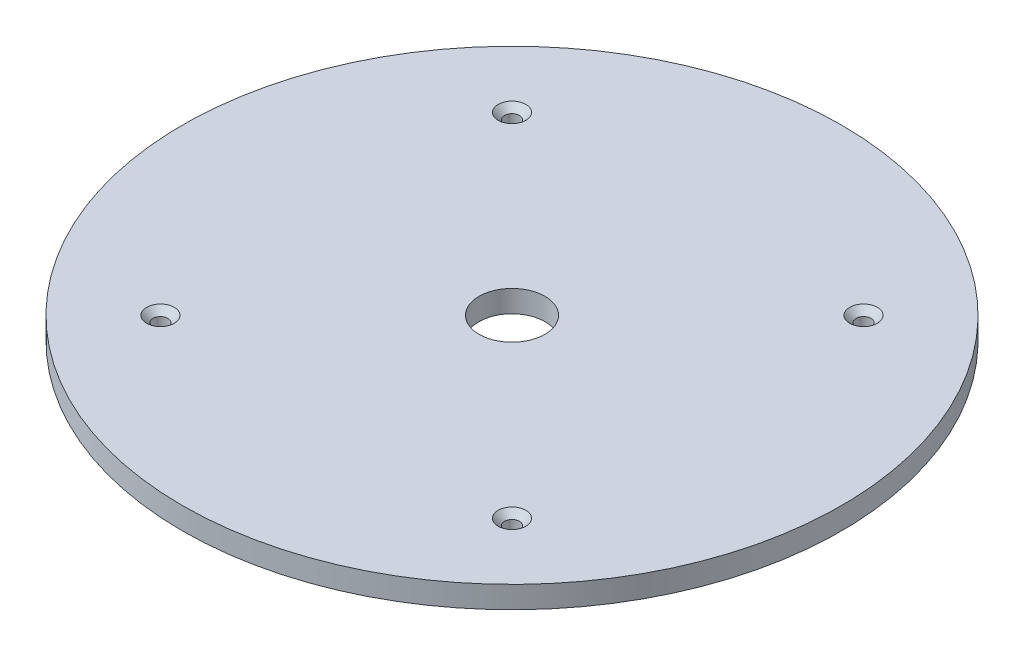
ISO-10303-21;
HEADER;
FILE_DESCRIPTION(('STEP AP214'),'2;1');
FILE_NAME('part.step','',(''),(''),'','','');
FILE_SCHEMA(('AUTOMOTIVE_DESIGN { 1 0 10303 214 1 1 1 1 }'));
ENDSEC;
DATA;
#1=APPLICATION_CONTEXT('core data for automotive mechanical design processes');
#2=APPLICATION_PROTOCOL_DEFINITION('international standard','automotive_design',2000,#1);
#3=PRODUCT_CONTEXT('',#1,'mechanical');
#4=PRODUCT('Part','Part','',(#3));
#5=PRODUCT_RELATED_PRODUCT_CATEGORY('part','',(#4));
#6=PRODUCT_DEFINITION_FORMATION('','',#4);
#7=PRODUCT_DEFINITION_CONTEXT('part definition',#1,'design');
#8=PRODUCT_DEFINITION('design','',#6,#7);
#9=PRODUCT_DEFINITION_SHAPE('','',#8);
#10=(LENGTH_UNIT() NAMED_UNIT(*) SI_UNIT(.MILLI.,.METRE.));
#11=(NAMED_UNIT(*) PLANE_ANGLE_UNIT() SI_UNIT($,.RADIAN.));
#12=(NAMED_UNIT(*) SI_UNIT($,.STERADIAN.) SOLID_ANGLE_UNIT());
#13=UNCERTAINTY_MEASURE_WITH_UNIT(LENGTH_MEASURE(1.E-05),#10,'distance_accuracy_value','');
#14=(GEOMETRIC_REPRESENTATION_CONTEXT(3) GLOBAL_UNCERTAINTY_ASSIGNED_CONTEXT((#13)) GLOBAL_UNIT_ASSIGNED_CONTEXT((#10,
#11,#12)) REPRESENTATION_CONTEXT('',''));
#15=CARTESIAN_POINT('',(0.,0.,0.));
#16=DIRECTION('',(0.,0.,1.));
#17=DIRECTION('',(1.,0.,0.));
#18=AXIS2_PLACEMENT_3D('',#15,#16,#17);
#19=CARTESIAN_POINT('',(0.,5.,0.));
#20=DIRECTION('',(0.,-1.,0.));
#21=DIRECTION('',(0.,0.,-1.));
#22=AXIS2_PLACEMENT_3D('',#19,#20,#21);
#23=CYLINDRICAL_SURFACE('',#22,75.);
#24=CARTESIAN_POINT('',(0.,5.,0.));
#25=DIRECTION('',(0.,1.,0.));
#26=DIRECTION('',(0.,0.,1.));
#27=AXIS2_PLACEMENT_3D('',#24,#25,#26);
#28=CIRCLE('',#27,75.);
#29=CARTESIAN_POINT('',(0.,5.,75.));
#30=VERTEX_POINT('',#29);
#31=EDGE_CURVE('E10',#30,#30,#28,.T.);
#32=ORIENTED_EDGE('',*,*,#31,.F.);
#33=EDGE_LOOP('',(#32));
#34=FACE_BOUND('',#33,.T.);
#35=CARTESIAN_POINT('',(0.,0.,0.));
#36=DIRECTION('',(0.,1.,0.));
#37=DIRECTION('',(0.,0.,1.));
#38=AXIS2_PLACEMENT_3D('',#35,#36,#37);
#39=CIRCLE('',#38,75.);
#40=CARTESIAN_POINT('',(0.,0.,75.));
#41=VERTEX_POINT('',#40);
#42=EDGE_CURVE('E39',#41,#41,#39,.T.);
#43=ORIENTED_EDGE('',*,*,#42,.T.);
#44=EDGE_LOOP('',(#43));
#45=FACE_BOUND('',#44,.T.);
#46=ADVANCED_FACE('F36',(#34,#45),#23,.T.);
#47=CARTESIAN_POINT('',(0.,5.,0.));
#48=DIRECTION('',(0.,1.,0.));
#49=DIRECTION('',(0.,0.,1.));
#50=AXIS2_PLACEMENT_3D('',#47,#48,#49);
#51=PLANE('',#50);
#52=CARTESIAN_POINT('',(0.,5.,0.));
#53=DIRECTION('',(0.,1.,0.));
#54=DIRECTION('',(0.,0.,1.));
#55=AXIS2_PLACEMENT_3D('',#52,#53,#54);
#56=CIRCLE('',#55,7.5);
#57=CARTESIAN_POINT('',(0.,5.,7.5));
#58=VERTEX_POINT('',#57);
#59=EDGE_CURVE('E98',#58,#58,#56,.T.);
#60=ORIENTED_EDGE('',*,*,#59,.F.);
#61=EDGE_LOOP('',(#60));
#62=FACE_BOUND('',#61,.T.);
#63=CARTESIAN_POINT('',(-40.0000000000008,5.,-40.));
#64=DIRECTION('',(0.,1.,0.));
#65=DIRECTION('',(0.,0.,1.));
#66=AXIS2_PLACEMENT_3D('',#63,#64,#65);
#67=CIRCLE('',#66,3.15);
#68=CARTESIAN_POINT('',(-40.0000000000008,5.,-36.85));
#69=VERTEX_POINT('',#68);
#70=EDGE_CURVE('E93',#69,#69,#67,.T.);
#71=ORIENTED_EDGE('',*,*,#70,.F.);
#72=EDGE_LOOP('',(#71));
#73=FACE_BOUND('',#72,.T.);
#74=CARTESIAN_POINT('',(39.9999999999992,5.,-40.));
#75=DIRECTION('',(0.,1.,0.));
#76=DIRECTION('',(0.,0.,1.));
#77=AXIS2_PLACEMENT_3D('',#74,#75,#76);
#78=CIRCLE('',#77,3.15);
#79=CARTESIAN_POINT('',(39.9999999999992,5.,-36.85));
#80=VERTEX_POINT('',#79);
#81=EDGE_CURVE('E81',#80,#80,#78,.T.);
#82=ORIENTED_EDGE('',*,*,#81,.F.);
#83=EDGE_LOOP('',(#82));
#84=FACE_BOUND('',#83,.T.);
#85=CARTESIAN_POINT('',(40.,5.,40.));
#86=DIRECTION('',(0.,1.,0.));
#87=DIRECTION('',(0.,0.,1.));
#88=AXIS2_PLACEMENT_3D('',#85,#86,#87);
#89=CIRCLE('',#88,3.15);
#90=CARTESIAN_POINT('',(40.,5.,43.15));
#91=VERTEX_POINT('',#90);
#92=EDGE_CURVE('E69',#91,#91,#89,.T.);
#93=ORIENTED_EDGE('',*,*,#92,.F.);
#94=EDGE_LOOP('',(#93));
#95=FACE_BOUND('',#94,.T.);
#96=CARTESIAN_POINT('',(-40.,5.,40.));
#97=DIRECTION('',(0.,1.,0.));
#98=DIRECTION('',(0.,0.,1.));
#99=AXIS2_PLACEMENT_3D('',#96,#97,#98);
#100=CIRCLE('',#99,3.15);
#101=CARTESIAN_POINT('',(-40.,5.,43.15));
#102=VERTEX_POINT('',#101);
#103=EDGE_CURVE('E57',#102,#102,#100,.T.);
#104=ORIENTED_EDGE('',*,*,#103,.F.);
#105=EDGE_LOOP('',(#104));
#106=FACE_BOUND('',#105,.T.);
#107=ORIENTED_EDGE('',*,*,#31,.T.);
#108=EDGE_LOOP('',(#107));
#109=FACE_BOUND('',#108,.T.);
#110=ADVANCED_FACE('F116',(#62,#73,#84,#95,#106,#109),#51,.T.);
#111=CARTESIAN_POINT('',(0.,0.,0.));
#112=DIRECTION('',(0.,1.,0.));
#113=DIRECTION('',(0.,0.,1.));
#114=AXIS2_PLACEMENT_3D('',#111,#112,#113);
#115=PLANE('',#114);
#116=CARTESIAN_POINT('',(0.,0.,0.));
#117=DIRECTION('',(0.,1.,0.));
#118=DIRECTION('',(0.,0.,1.));
#119=AXIS2_PLACEMENT_3D('',#116,#117,#118);
#120=CIRCLE('',#119,7.5);
#121=CARTESIAN_POINT('',(0.,0.,7.5));
#122=VERTEX_POINT('',#121);
#123=EDGE_CURVE('E97',#122,#122,#120,.T.);
#124=ORIENTED_EDGE('',*,*,#123,.T.);
#125=EDGE_LOOP('',(#124));
#126=FACE_BOUND('',#125,.T.);
#127=CARTESIAN_POINT('',(-40.0000000000008,0.,-40.));
#128=DIRECTION('',(0.,1.,0.));
#129=DIRECTION('',(0.,0.,1.));
#130=AXIS2_PLACEMENT_3D('',#127,#128,#129);
#131=CIRCLE('',#130,1.7);
#132=CARTESIAN_POINT('',(-40.0000000000008,0.,-38.3));
#133=VERTEX_POINT('',#132);
#134=EDGE_CURVE('E85',#133,#133,#131,.T.);
#135=ORIENTED_EDGE('',*,*,#134,.T.);
#136=EDGE_LOOP('',(#135));
#137=FACE_BOUND('',#136,.T.);
#138=CARTESIAN_POINT('',(39.9999999999992,0.,-40.));
#139=DIRECTION('',(0.,1.,0.));
#140=DIRECTION('',(0.,0.,1.));
#141=AXIS2_PLACEMENT_3D('',#138,#139,#140);
#142=CIRCLE('',#141,1.7);
#143=CARTESIAN_POINT('',(39.9999999999992,0.,-38.3));
#144=VERTEX_POINT('',#143);
#145=EDGE_CURVE('E73',#144,#144,#142,.T.);
#146=ORIENTED_EDGE('',*,*,#145,.T.);
#147=EDGE_LOOP('',(#146));
#148=FACE_BOUND('',#147,.T.);
#149=CARTESIAN_POINT('',(40.,0.,40.));
#150=DIRECTION('',(0.,1.,0.));
#151=DIRECTION('',(0.,0.,1.));
#152=AXIS2_PLACEMENT_3D('',#149,#150,#151);
#153=CIRCLE('',#152,1.7);
#154=CARTESIAN_POINT('',(40.,0.,41.7));
#155=VERTEX_POINT('',#154);
#156=EDGE_CURVE('E61',#155,#155,#153,.T.);
#157=ORIENTED_EDGE('',*,*,#156,.T.);
#158=EDGE_LOOP('',(#157));
#159=FACE_BOUND('',#158,.T.);
#160=CARTESIAN_POINT('',(-40.,0.,40.));
#161=DIRECTION('',(0.,1.,0.));
#162=DIRECTION('',(0.,0.,1.));
#163=AXIS2_PLACEMENT_3D('',#160,#161,#162);
#164=CIRCLE('',#163,1.7);
#165=CARTESIAN_POINT('',(-40.,0.,41.7));
#166=VERTEX_POINT('',#165);
#167=EDGE_CURVE('E48',#166,#166,#164,.T.);
#168=ORIENTED_EDGE('',*,*,#167,.T.);
#169=EDGE_LOOP('',(#168));
#170=FACE_BOUND('',#169,.T.);
#171=ORIENTED_EDGE('',*,*,#42,.F.);
#172=EDGE_LOOP('',(#171));
#173=FACE_BOUND('',#172,.T.);
#174=ADVANCED_FACE('F106',(#126,#137,#148,#159,#170,#173),#115,.F.);
#175=CARTESIAN_POINT('',(-40.,5.,40.));
#176=DIRECTION('',(0.,1.,0.));
#177=DIRECTION('',(0.,0.,1.));
#178=AXIS2_PLACEMENT_3D('',#175,#176,#177);
#179=CYLINDRICAL_SURFACE('',#178,1.7);
#180=ORIENTED_EDGE('',*,*,#167,.F.);
#181=EDGE_LOOP('',(#180));
#182=FACE_BOUND('',#181,.T.);
#183=CARTESIAN_POINT('',(-40.,3.55,40.));
#184=DIRECTION('',(0.,1.,0.));
#185=DIRECTION('',(0.,0.,1.));
#186=AXIS2_PLACEMENT_3D('',#183,#184,#185);
#187=CIRCLE('',#186,1.7);
#188=CARTESIAN_POINT('',(-40.,3.55,41.7));
#189=VERTEX_POINT('',#188);
#190=EDGE_CURVE('E53',#189,#189,#187,.T.);
#191=ORIENTED_EDGE('',*,*,#190,.T.);
#192=EDGE_LOOP('',(#191));
#193=FACE_BOUND('',#192,.T.);
#194=ADVANCED_FACE('F131',(#182,#193),#179,.F.);
#195=CARTESIAN_POINT('',(-40.,5.,40.));
#196=DIRECTION('',(0.,1.,0.));
#197=DIRECTION('',(0.,0.,1.));
#198=AXIS2_PLACEMENT_3D('',#195,#196,#197);
#199=CONICAL_SURFACE('',#198,3.15,0.785398163397448);
#200=ORIENTED_EDGE('',*,*,#190,.F.);
#201=EDGE_LOOP('',(#200));
#202=FACE_BOUND('',#201,.T.);
#203=ORIENTED_EDGE('',*,*,#103,.T.);
#204=EDGE_LOOP('',(#203));
#205=FACE_BOUND('',#204,.T.);
#206=ADVANCED_FACE('F128',(#202,#205),#199,.F.);
#207=CARTESIAN_POINT('',(40.,5.,40.));
#208=DIRECTION('',(0.,1.,0.));
#209=DIRECTION('',(0.,0.,1.));
#210=AXIS2_PLACEMENT_3D('',#207,#208,#209);
#211=CYLINDRICAL_SURFACE('',#210,1.7);
#212=ORIENTED_EDGE('',*,*,#156,.F.);
#213=EDGE_LOOP('',(#212));
#214=FACE_BOUND('',#213,.T.);
#215=CARTESIAN_POINT('',(40.,3.55,40.));
#216=DIRECTION('',(0.,1.,0.));
#217=DIRECTION('',(0.,0.,1.));
#218=AXIS2_PLACEMENT_3D('',#215,#216,#217);
#219=CIRCLE('',#218,1.7);
#220=CARTESIAN_POINT('',(40.,3.55,41.7));
#221=VERTEX_POINT('',#220);
#222=EDGE_CURVE('E65',#221,#221,#219,.T.);
#223=ORIENTED_EDGE('',*,*,#222,.T.);
#224=EDGE_LOOP('',(#223));
#225=FACE_BOUND('',#224,.T.);
#226=ADVANCED_FACE('F130',(#214,#225),#211,.F.);
#227=CARTESIAN_POINT('',(40.,5.,40.));
#228=DIRECTION('',(0.,1.,0.));
#229=DIRECTION('',(0.,0.,1.));
#230=AXIS2_PLACEMENT_3D('',#227,#228,#229);
#231=CONICAL_SURFACE('',#230,3.15,0.785398163397448);
#232=ORIENTED_EDGE('',*,*,#222,.F.);
#233=EDGE_LOOP('',(#232));
#234=FACE_BOUND('',#233,.T.);
#235=ORIENTED_EDGE('',*,*,#92,.T.);
#236=EDGE_LOOP('',(#235));
#237=FACE_BOUND('',#236,.T.);
#238=ADVANCED_FACE('F138',(#234,#237),#231,.F.);
#239=CARTESIAN_POINT('',(39.9999999999992,5.,-40.));
#240=DIRECTION('',(0.,1.,0.));
#241=DIRECTION('',(0.,0.,1.));
#242=AXIS2_PLACEMENT_3D('',#239,#240,#241);
#243=CYLINDRICAL_SURFACE('',#242,1.7);
#244=ORIENTED_EDGE('',*,*,#145,.F.);
#245=EDGE_LOOP('',(#244));
#246=FACE_BOUND('',#245,.T.);
#247=CARTESIAN_POINT('',(39.9999999999992,3.55,-40.));
#248=DIRECTION('',(0.,1.,0.));
#249=DIRECTION('',(0.,0.,1.));
#250=AXIS2_PLACEMENT_3D('',#247,#248,#249);
#251=CIRCLE('',#250,1.7);
#252=CARTESIAN_POINT('',(39.9999999999992,3.55,-38.3));
#253=VERTEX_POINT('',#252);
#254=EDGE_CURVE('E77',#253,#253,#251,.T.);
#255=ORIENTED_EDGE('',*,*,#254,.T.);
#256=EDGE_LOOP('',(#255));
#257=FACE_BOUND('',#256,.T.);
#258=ADVANCED_FACE('F184',(#246,#257),#243,.F.);
#259=CARTESIAN_POINT('',(39.9999999999992,5.,-40.));
#260=DIRECTION('',(0.,1.,0.));
#261=DIRECTION('',(0.,0.,1.));
#262=AXIS2_PLACEMENT_3D('',#259,#260,#261);
#263=CONICAL_SURFACE('',#262,3.15,0.785398163397448);
#264=ORIENTED_EDGE('',*,*,#254,.F.);
#265=EDGE_LOOP('',(#264));
#266=FACE_BOUND('',#265,.T.);
#267=ORIENTED_EDGE('',*,*,#81,.T.);
#268=EDGE_LOOP('',(#267));
#269=FACE_BOUND('',#268,.T.);
#270=ADVANCED_FACE('F176',(#266,#269),#263,.F.);
#271=CARTESIAN_POINT('',(-40.0000000000008,5.,-40.));
#272=DIRECTION('',(0.,1.,0.));
#273=DIRECTION('',(0.,0.,1.));
#274=AXIS2_PLACEMENT_3D('',#271,#272,#273);
#275=CYLINDRICAL_SURFACE('',#274,1.7);
#276=ORIENTED_EDGE('',*,*,#134,.F.);
#277=EDGE_LOOP('',(#276));
#278=FACE_BOUND('',#277,.T.);
#279=CARTESIAN_POINT('',(-40.0000000000008,3.55,-40.));
#280=DIRECTION('',(0.,1.,0.));
#281=DIRECTION('',(0.,0.,1.));
#282=AXIS2_PLACEMENT_3D('',#279,#280,#281);
#283=CIRCLE('',#282,1.7);
#284=CARTESIAN_POINT('',(-40.0000000000008,3.55,-38.3));
#285=VERTEX_POINT('',#284);
#286=EDGE_CURVE('E89',#285,#285,#283,.T.);
#287=ORIENTED_EDGE('',*,*,#286,.T.);
#288=EDGE_LOOP('',(#287));
#289=FACE_BOUND('',#288,.T.);
#290=ADVANCED_FACE('F169',(#278,#289),#275,.F.);
#291=CARTESIAN_POINT('',(-40.0000000000008,5.,-40.));
#292=DIRECTION('',(0.,1.,0.));
#293=DIRECTION('',(0.,0.,1.));
#294=AXIS2_PLACEMENT_3D('',#291,#292,#293);
#295=CONICAL_SURFACE('',#294,3.15,0.785398163397448);
#296=ORIENTED_EDGE('',*,*,#286,.F.);
#297=EDGE_LOOP('',(#296));
#298=FACE_BOUND('',#297,.T.);
#299=ORIENTED_EDGE('',*,*,#70,.T.);
#300=EDGE_LOOP('',(#299));
#301=FACE_BOUND('',#300,.T.);
#302=ADVANCED_FACE('F112',(#298,#301),#295,.F.);
#303=CARTESIAN_POINT('',(0.,0.,0.));
#304=DIRECTION('',(0.,1.,0.));
#305=DIRECTION('',(0.,0.,1.));
#306=AXIS2_PLACEMENT_3D('',#303,#304,#305);
#307=CYLINDRICAL_SURFACE('',#306,7.5);
#308=ORIENTED_EDGE('',*,*,#123,.F.);
#309=EDGE_LOOP('',(#308));
#310=FACE_BOUND('',#309,.T.);
#311=ORIENTED_EDGE('',*,*,#59,.T.);
#312=EDGE_LOOP('',(#311));
#313=FACE_BOUND('',#312,.T.);
#314=ADVANCED_FACE('F109',(#310,#313),#307,.F.);
#315=CLOSED_SHELL('',(#46,#110,#174,#194,#206,#226,#238,#258,#270,#290,#302,#314));
#316=MANIFOLD_SOLID_BREP('B2',#315);
#317=ADVANCED_BREP_SHAPE_REPRESENTATION('',(#18,#316),#14);
#318=SHAPE_DEFINITION_REPRESENTATION(#9,#317);
ENDSEC;
END-ISO-10303-21;
